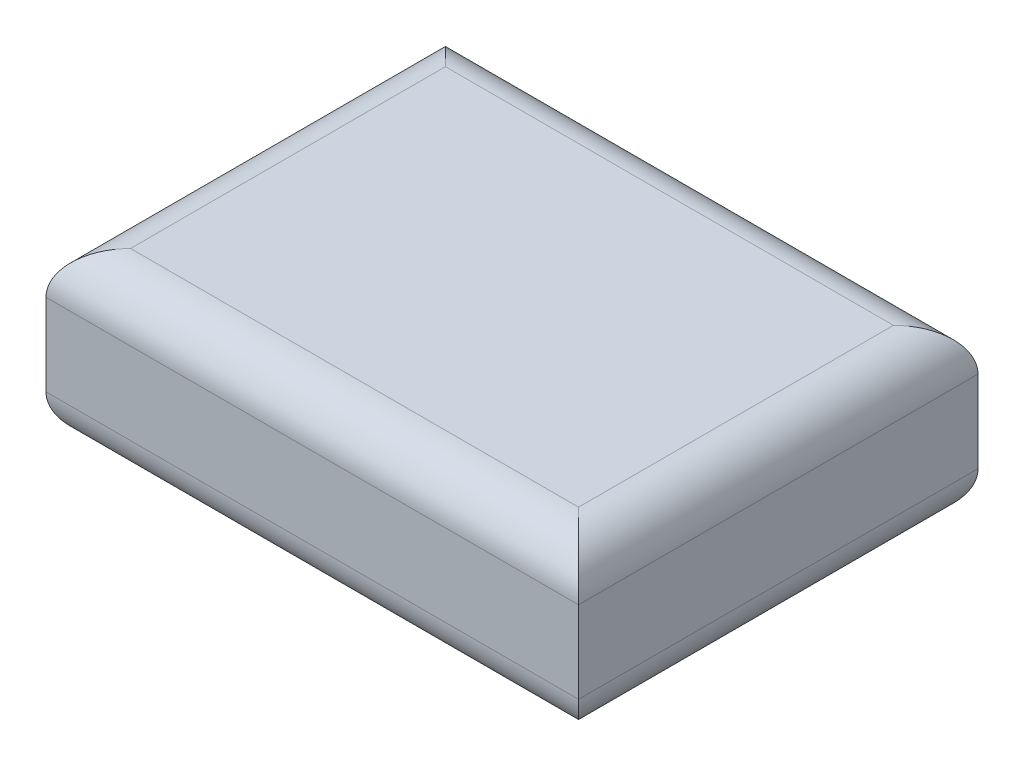
ISO-10303-21;
HEADER;
FILE_DESCRIPTION(('STEP AP214'),'2;1');
FILE_NAME('part.step','',(''),(''),'','','');
FILE_SCHEMA(('AUTOMOTIVE_DESIGN { 1 0 10303 214 1 1 1 1 }'));
ENDSEC;
DATA;
#1=APPLICATION_CONTEXT('core data for automotive mechanical design processes');
#2=APPLICATION_PROTOCOL_DEFINITION('international standard','automotive_design',2000,#1);
#3=PRODUCT_CONTEXT('',#1,'mechanical');
#4=PRODUCT('Part','Part','',(#3));
#5=PRODUCT_RELATED_PRODUCT_CATEGORY('part','',(#4));
#6=PRODUCT_DEFINITION_FORMATION('','',#4);
#7=PRODUCT_DEFINITION_CONTEXT('part definition',#1,'design');
#8=PRODUCT_DEFINITION('design','',#6,#7);
#9=PRODUCT_DEFINITION_SHAPE('','',#8);
#10=(LENGTH_UNIT() NAMED_UNIT(*) SI_UNIT(.MILLI.,.METRE.));
#11=(NAMED_UNIT(*) PLANE_ANGLE_UNIT() SI_UNIT($,.RADIAN.));
#12=(NAMED_UNIT(*) SI_UNIT($,.STERADIAN.) SOLID_ANGLE_UNIT());
#13=UNCERTAINTY_MEASURE_WITH_UNIT(LENGTH_MEASURE(1.E-05),#10,'distance_accuracy_value','');
#14=(GEOMETRIC_REPRESENTATION_CONTEXT(3) GLOBAL_UNCERTAINTY_ASSIGNED_CONTEXT((#13)) GLOBAL_UNIT_ASSIGNED_CONTEXT((#10,
#11,#12)) REPRESENTATION_CONTEXT('',''));
#15=CARTESIAN_POINT('',(0.,0.,0.));
#16=DIRECTION('',(0.,0.,1.));
#17=DIRECTION('',(1.,0.,0.));
#18=AXIS2_PLACEMENT_3D('',#15,#16,#17);
#19=CARTESIAN_POINT('',(0.,0.,12.));
#20=DIRECTION('',(1.,0.,0.));
#21=DIRECTION('',(0.,0.,-1.));
#22=AXIS2_PLACEMENT_3D('',#19,#20,#21);
#23=PLANE('',#22);
#24=DIRECTION('',(0.,-1.,0.));
#25=VECTOR('',#24,1.);
#26=CARTESIAN_POINT('',(0.,0.,0.));
#27=LINE('',#26,#25);
#28=CARTESIAN_POINT('',(0.,3.73,0.));
#29=VERTEX_POINT('',#28);
#30=CARTESIAN_POINT('',(0.,1.27,0.));
#31=VERTEX_POINT('',#30);
#32=EDGE_CURVE('E129',#29,#31,#27,.T.);
#33=ORIENTED_EDGE('',*,*,#32,.T.);
#34=DIRECTION('',(0.,0.,-1.));
#35=VECTOR('',#34,1.);
#36=CARTESIAN_POINT('',(0.,1.27,12.));
#37=LINE('',#36,#35);
#38=CARTESIAN_POINT('',(0.,1.27,12.));
#39=VERTEX_POINT('',#38);
#40=EDGE_CURVE('E52',#31,#39,#37,.F.);
#41=ORIENTED_EDGE('',*,*,#40,.T.);
#42=DIRECTION('',(0.,-1.,0.));
#43=VECTOR('',#42,1.);
#44=CARTESIAN_POINT('',(0.,0.,12.));
#45=LINE('',#44,#43);
#46=CARTESIAN_POINT('',(0.,3.73,12.));
#47=VERTEX_POINT('',#46);
#48=EDGE_CURVE('E178',#47,#39,#45,.T.);
#49=ORIENTED_EDGE('',*,*,#48,.F.);
#50=DIRECTION('',(0.,0.,-1.));
#51=VECTOR('',#50,1.);
#52=CARTESIAN_POINT('',(0.,3.73,12.));
#53=LINE('',#52,#51);
#54=EDGE_CURVE('E153',#47,#29,#53,.T.);
#55=ORIENTED_EDGE('',*,*,#54,.T.);
#56=EDGE_LOOP('',(#33,#41,#49,#55));
#57=FACE_BOUND('',#56,.T.);
#58=ADVANCED_FACE('F35',(#57),#23,.F.);
#59=CARTESIAN_POINT('',(0.,0.,12.));
#60=DIRECTION('',(0.,1.,0.));
#61=DIRECTION('',(0.,0.,1.));
#62=AXIS2_PLACEMENT_3D('',#59,#60,#61);
#63=PLANE('',#62);
#64=DIRECTION('',(0.,0.,-1.));
#65=VECTOR('',#64,1.);
#66=CARTESIAN_POINT('',(1.27,0.,12.));
#67=LINE('',#66,#65);
#68=CARTESIAN_POINT('',(1.27,0.,10.73));
#69=VERTEX_POINT('',#68);
#70=CARTESIAN_POINT('',(1.27,0.,1.27));
#71=VERTEX_POINT('',#70);
#72=EDGE_CURVE('E162',#69,#71,#67,.T.);
#73=ORIENTED_EDGE('',*,*,#72,.T.);
#74=DIRECTION('',(1.,0.,0.));
#75=VECTOR('',#74,1.);
#76=CARTESIAN_POINT('',(16.,0.,1.27));
#77=LINE('',#76,#75);
#78=CARTESIAN_POINT('',(14.73,0.,1.27));
#79=VERTEX_POINT('',#78);
#80=EDGE_CURVE('E159',#71,#79,#77,.T.);
#81=ORIENTED_EDGE('',*,*,#80,.T.);
#82=DIRECTION('',(0.,0.,-1.));
#83=VECTOR('',#82,1.);
#84=CARTESIAN_POINT('',(14.73,0.,12.));
#85=LINE('',#84,#83);
#86=CARTESIAN_POINT('',(14.73,0.,10.73));
#87=VERTEX_POINT('',#86);
#88=EDGE_CURVE('E166',#79,#87,#85,.F.);
#89=ORIENTED_EDGE('',*,*,#88,.T.);
#90=DIRECTION('',(1.,0.,0.));
#91=VECTOR('',#90,1.);
#92=CARTESIAN_POINT('',(0.,0.,10.73));
#93=LINE('',#92,#91);
#94=EDGE_CURVE('E164',#87,#69,#93,.F.);
#95=ORIENTED_EDGE('',*,*,#94,.T.);
#96=EDGE_LOOP('',(#73,#81,#89,#95));
#97=FACE_BOUND('',#96,.T.);
#98=ADVANCED_FACE('F208',(#97),#63,.F.);
#99=CARTESIAN_POINT('',(16.,0.,12.));
#100=DIRECTION('',(-1.,0.,0.));
#101=DIRECTION('',(0.,0.,1.));
#102=AXIS2_PLACEMENT_3D('',#99,#100,#101);
#103=PLANE('',#102);
#104=DIRECTION('',(0.,1.,0.));
#105=VECTOR('',#104,1.);
#106=CARTESIAN_POINT('',(16.,0.,0.));
#107=LINE('',#106,#105);
#108=CARTESIAN_POINT('',(16.,1.27,0.));
#109=VERTEX_POINT('',#108);
#110=CARTESIAN_POINT('',(16.,3.73,0.));
#111=VERTEX_POINT('',#110);
#112=EDGE_CURVE('E175',#109,#111,#107,.T.);
#113=ORIENTED_EDGE('',*,*,#112,.T.);
#114=DIRECTION('',(0.,0.,-1.));
#115=VECTOR('',#114,1.);
#116=CARTESIAN_POINT('',(16.,3.73,12.));
#117=LINE('',#116,#115);
#118=CARTESIAN_POINT('',(16.,3.73,12.));
#119=VERTEX_POINT('',#118);
#120=EDGE_CURVE('E168',#111,#119,#117,.F.);
#121=ORIENTED_EDGE('',*,*,#120,.T.);
#122=DIRECTION('',(0.,1.,0.));
#123=VECTOR('',#122,1.);
#124=CARTESIAN_POINT('',(16.,0.,12.));
#125=LINE('',#124,#123);
#126=CARTESIAN_POINT('',(16.,1.27,12.));
#127=VERTEX_POINT('',#126);
#128=EDGE_CURVE('E123',#127,#119,#125,.T.);
#129=ORIENTED_EDGE('',*,*,#128,.F.);
#130=DIRECTION('',(0.,0.,-1.));
#131=VECTOR('',#130,1.);
#132=CARTESIAN_POINT('',(16.,1.27,12.));
#133=LINE('',#132,#131);
#134=EDGE_CURVE('E171',#127,#109,#133,.T.);
#135=ORIENTED_EDGE('',*,*,#134,.T.);
#136=EDGE_LOOP('',(#113,#121,#129,#135));
#137=FACE_BOUND('',#136,.T.);
#138=ADVANCED_FACE('F190',(#137),#103,.F.);
#139=CARTESIAN_POINT('',(0.,5.,12.));
#140=DIRECTION('',(0.,-1.,0.));
#141=DIRECTION('',(0.,0.,-1.));
#142=AXIS2_PLACEMENT_3D('',#139,#140,#141);
#143=PLANE('',#142);
#144=DIRECTION('',(-1.,0.,0.));
#145=VECTOR('',#144,1.);
#146=CARTESIAN_POINT('',(0.,5.,10.73));
#147=LINE('',#146,#145);
#148=CARTESIAN_POINT('',(1.27,5.,10.73));
#149=VERTEX_POINT('',#148);
#150=CARTESIAN_POINT('',(14.73,5.,10.73));
#151=VERTEX_POINT('',#150);
#152=EDGE_CURVE('E112',#149,#151,#147,.F.);
#153=ORIENTED_EDGE('',*,*,#152,.T.);
#154=DIRECTION('',(0.,0.,-1.));
#155=VECTOR('',#154,1.);
#156=CARTESIAN_POINT('',(14.73,5.,12.));
#157=LINE('',#156,#155);
#158=CARTESIAN_POINT('',(14.73,5.,1.27));
#159=VERTEX_POINT('',#158);
#160=EDGE_CURVE('E108',#151,#159,#157,.T.);
#161=ORIENTED_EDGE('',*,*,#160,.T.);
#162=DIRECTION('',(-1.,0.,0.));
#163=VECTOR('',#162,1.);
#164=CARTESIAN_POINT('',(0.,5.,1.27));
#165=LINE('',#164,#163);
#166=CARTESIAN_POINT('',(1.27,5.,1.27));
#167=VERTEX_POINT('',#166);
#168=EDGE_CURVE('E102',#159,#167,#165,.T.);
#169=ORIENTED_EDGE('',*,*,#168,.T.);
#170=DIRECTION('',(0.,0.,-1.));
#171=VECTOR('',#170,1.);
#172=CARTESIAN_POINT('',(1.27,5.,12.));
#173=LINE('',#172,#171);
#174=EDGE_CURVE('E105',#167,#149,#173,.F.);
#175=ORIENTED_EDGE('',*,*,#174,.T.);
#176=EDGE_LOOP('',(#153,#161,#169,#175));
#177=FACE_BOUND('',#176,.T.);
#178=ADVANCED_FACE('F104',(#177),#143,.F.);
#179=CARTESIAN_POINT('',(0.,0.,12.));
#180=DIRECTION('',(0.,0.,-1.));
#181=DIRECTION('',(-1.,0.,0.));
#182=AXIS2_PLACEMENT_3D('',#179,#180,#181);
#183=PLANE('',#182);
#184=ORIENTED_EDGE('',*,*,#48,.T.);
#185=DIRECTION('',(1.,0.,0.));
#186=VECTOR('',#185,1.);
#187=CARTESIAN_POINT('',(0.,1.27,12.));
#188=LINE('',#187,#186);
#189=EDGE_CURVE('E11',#39,#127,#188,.T.);
#190=ORIENTED_EDGE('',*,*,#189,.T.);
#191=ORIENTED_EDGE('',*,*,#128,.T.);
#192=DIRECTION('',(-1.,0.,0.));
#193=VECTOR('',#192,1.);
#194=CARTESIAN_POINT('',(0.,3.73,12.));
#195=LINE('',#194,#193);
#196=EDGE_CURVE('E44',#119,#47,#195,.T.);
#197=ORIENTED_EDGE('',*,*,#196,.T.);
#198=EDGE_LOOP('',(#184,#190,#191,#197));
#199=FACE_BOUND('',#198,.T.);
#200=ADVANCED_FACE('F182',(#199),#183,.F.);
#201=CARTESIAN_POINT('',(0.,0.,0.));
#202=DIRECTION('',(0.,0.,-1.));
#203=DIRECTION('',(-1.,0.,0.));
#204=AXIS2_PLACEMENT_3D('',#201,#202,#203);
#205=PLANE('',#204);
#206=ORIENTED_EDGE('',*,*,#112,.F.);
#207=DIRECTION('',(1.,0.,0.));
#208=VECTOR('',#207,1.);
#209=CARTESIAN_POINT('',(0.,1.27,0.));
#210=LINE('',#209,#208);
#211=EDGE_CURVE('E155',#109,#31,#210,.F.);
#212=ORIENTED_EDGE('',*,*,#211,.T.);
#213=ORIENTED_EDGE('',*,*,#32,.F.);
#214=DIRECTION('',(-1.,0.,0.));
#215=VECTOR('',#214,1.);
#216=CARTESIAN_POINT('',(16.,3.73,0.));
#217=LINE('',#216,#215);
#218=EDGE_CURVE('E126',#29,#111,#217,.F.);
#219=ORIENTED_EDGE('',*,*,#218,.T.);
#220=EDGE_LOOP('',(#206,#212,#213,#219));
#221=FACE_BOUND('',#220,.T.);
#222=ADVANCED_FACE('F193',(#221),#205,.T.);
#223=CARTESIAN_POINT('',(1.27,3.73,12.));
#224=DIRECTION('',(0.,0.,-1.));
#225=DIRECTION('',(-1.,0.,0.));
#226=AXIS2_PLACEMENT_3D('',#223,#224,#225);
#227=CYLINDRICAL_SURFACE('',#226,1.27);
#228=CARTESIAN_POINT('',(1.27,3.73,1.27));
#229=DIRECTION('',(0.707106781186547,0.,-0.707106781186547));
#230=DIRECTION('',(-0.707106781186547,0.,-0.707106781186547));
#231=AXIS2_PLACEMENT_3D('',#228,#229,#230);
#232=ELLIPSE('',#231,1.79605122421383,1.27);
#233=EDGE_CURVE('E118',#29,#167,#232,.T.);
#234=ORIENTED_EDGE('',*,*,#233,.F.);
#235=ORIENTED_EDGE('',*,*,#54,.F.);
#236=CARTESIAN_POINT('',(1.27,3.73,10.73));
#237=DIRECTION('',(-0.707106781186547,0.,-0.707106781186547));
#238=DIRECTION('',(0.707106781186547,0.,-0.707106781186547));
#239=AXIS2_PLACEMENT_3D('',#236,#237,#238);
#240=ELLIPSE('',#239,1.79605122421383,1.27);
#241=EDGE_CURVE('E121',#149,#47,#240,.F.);
#242=ORIENTED_EDGE('',*,*,#241,.F.);
#243=ORIENTED_EDGE('',*,*,#174,.F.);
#244=EDGE_LOOP('',(#234,#235,#242,#243));
#245=FACE_BOUND('',#244,.T.);
#246=ADVANCED_FACE('F116',(#245),#227,.T.);
#247=CARTESIAN_POINT('',(0.,3.73,10.73));
#248=DIRECTION('',(-1.,0.,0.));
#249=DIRECTION('',(0.,0.,1.));
#250=AXIS2_PLACEMENT_3D('',#247,#248,#249);
#251=CYLINDRICAL_SURFACE('',#250,1.27);
#252=ORIENTED_EDGE('',*,*,#241,.T.);
#253=ORIENTED_EDGE('',*,*,#196,.F.);
#254=CARTESIAN_POINT('',(14.73,3.73,10.73));
#255=DIRECTION('',(-0.707106781186547,0.,0.707106781186547));
#256=DIRECTION('',(-0.707106781186547,0.,-0.707106781186547));
#257=AXIS2_PLACEMENT_3D('',#254,#255,#256);
#258=ELLIPSE('',#257,1.79605122421383,1.27);
#259=EDGE_CURVE('E127',#151,#119,#258,.F.);
#260=ORIENTED_EDGE('',*,*,#259,.F.);
#261=ORIENTED_EDGE('',*,*,#152,.F.);
#262=EDGE_LOOP('',(#252,#253,#260,#261));
#263=FACE_BOUND('',#262,.T.);
#264=ADVANCED_FACE('F221',(#263),#251,.T.);
#265=CARTESIAN_POINT('',(0.,3.73,1.27));
#266=DIRECTION('',(1.,0.,0.));
#267=DIRECTION('',(0.,0.,-1.));
#268=AXIS2_PLACEMENT_3D('',#265,#266,#267);
#269=CYLINDRICAL_SURFACE('',#268,1.27);
#270=ORIENTED_EDGE('',*,*,#233,.T.);
#271=ORIENTED_EDGE('',*,*,#168,.F.);
#272=CARTESIAN_POINT('',(14.73,3.73,1.27));
#273=DIRECTION('',(0.707106781186547,0.,0.707106781186547));
#274=DIRECTION('',(0.707106781186547,0.,-0.707106781186547));
#275=AXIS2_PLACEMENT_3D('',#272,#273,#274);
#276=ELLIPSE('',#275,1.79605122421383,1.27);
#277=EDGE_CURVE('E131',#111,#159,#276,.T.);
#278=ORIENTED_EDGE('',*,*,#277,.F.);
#279=ORIENTED_EDGE('',*,*,#218,.F.);
#280=EDGE_LOOP('',(#270,#271,#278,#279));
#281=FACE_BOUND('',#280,.T.);
#282=ADVANCED_FACE('F125',(#281),#269,.T.);
#283=CARTESIAN_POINT('',(14.73,3.73,12.));
#284=DIRECTION('',(0.,0.,-1.));
#285=DIRECTION('',(-1.,0.,0.));
#286=AXIS2_PLACEMENT_3D('',#283,#284,#285);
#287=CYLINDRICAL_SURFACE('',#286,1.27);
#288=ORIENTED_EDGE('',*,*,#259,.T.);
#289=ORIENTED_EDGE('',*,*,#120,.F.);
#290=ORIENTED_EDGE('',*,*,#277,.T.);
#291=ORIENTED_EDGE('',*,*,#160,.F.);
#292=EDGE_LOOP('',(#288,#289,#290,#291));
#293=FACE_BOUND('',#292,.T.);
#294=ADVANCED_FACE('F206',(#293),#287,.T.);
#295=CARTESIAN_POINT('',(0.,1.27,10.73));
#296=DIRECTION('',(1.,0.,0.));
#297=DIRECTION('',(0.,0.,-1.));
#298=AXIS2_PLACEMENT_3D('',#295,#296,#297);
#299=CYLINDRICAL_SURFACE('',#298,1.27);
#300=CARTESIAN_POINT('',(14.73,1.27,10.73));
#301=DIRECTION('',(0.707106781186547,0.,-0.707106781186547));
#302=DIRECTION('',(-0.707106781186547,0.,-0.707106781186547));
#303=AXIS2_PLACEMENT_3D('',#300,#301,#302);
#304=ELLIPSE('',#303,1.79605122421383,1.27);
#305=EDGE_CURVE('E138',#127,#87,#304,.T.);
#306=ORIENTED_EDGE('',*,*,#305,.F.);
#307=ORIENTED_EDGE('',*,*,#189,.F.);
#308=CARTESIAN_POINT('',(1.27,1.27,10.73));
#309=DIRECTION('',(0.707106781186547,0.,0.707106781186547));
#310=DIRECTION('',(0.707106781186547,0.,-0.707106781186547));
#311=AXIS2_PLACEMENT_3D('',#308,#309,#310);
#312=ELLIPSE('',#311,1.79605122421383,1.27);
#313=EDGE_CURVE('E39',#69,#39,#312,.F.);
#314=ORIENTED_EDGE('',*,*,#313,.F.);
#315=ORIENTED_EDGE('',*,*,#94,.F.);
#316=EDGE_LOOP('',(#306,#307,#314,#315));
#317=FACE_BOUND('',#316,.T.);
#318=ADVANCED_FACE('F37',(#317),#299,.T.);
#319=CARTESIAN_POINT('',(1.27,1.27,12.));
#320=DIRECTION('',(0.,0.,-1.));
#321=DIRECTION('',(-1.,0.,0.));
#322=AXIS2_PLACEMENT_3D('',#319,#320,#321);
#323=CYLINDRICAL_SURFACE('',#322,1.27);
#324=ORIENTED_EDGE('',*,*,#313,.T.);
#325=ORIENTED_EDGE('',*,*,#40,.F.);
#326=CARTESIAN_POINT('',(1.27,1.27,1.27));
#327=DIRECTION('',(0.707106781186547,0.,-0.707106781186547));
#328=DIRECTION('',(-0.707106781186547,0.,-0.707106781186547));
#329=AXIS2_PLACEMENT_3D('',#326,#327,#328);
#330=ELLIPSE('',#329,1.79605122421383,1.27);
#331=EDGE_CURVE('E137',#71,#31,#330,.T.);
#332=ORIENTED_EDGE('',*,*,#331,.F.);
#333=ORIENTED_EDGE('',*,*,#72,.F.);
#334=EDGE_LOOP('',(#324,#325,#332,#333));
#335=FACE_BOUND('',#334,.T.);
#336=ADVANCED_FACE('F199',(#335),#323,.T.);
#337=CARTESIAN_POINT('',(14.73,1.27,12.));
#338=DIRECTION('',(0.,0.,-1.));
#339=DIRECTION('',(-1.,0.,0.));
#340=AXIS2_PLACEMENT_3D('',#337,#338,#339);
#341=CYLINDRICAL_SURFACE('',#340,1.27);
#342=ORIENTED_EDGE('',*,*,#305,.T.);
#343=ORIENTED_EDGE('',*,*,#88,.F.);
#344=CARTESIAN_POINT('',(14.73,1.27,1.27));
#345=DIRECTION('',(-0.707106781186547,0.,-0.707106781186547));
#346=DIRECTION('',(0.707106781186547,0.,-0.707106781186547));
#347=AXIS2_PLACEMENT_3D('',#344,#345,#346);
#348=ELLIPSE('',#347,1.79605122421383,1.27);
#349=EDGE_CURVE('E135',#109,#79,#348,.T.);
#350=ORIENTED_EDGE('',*,*,#349,.F.);
#351=ORIENTED_EDGE('',*,*,#134,.F.);
#352=EDGE_LOOP('',(#342,#343,#350,#351));
#353=FACE_BOUND('',#352,.T.);
#354=ADVANCED_FACE('F187',(#353),#341,.T.);
#355=CARTESIAN_POINT('',(0.,1.27,1.27));
#356=DIRECTION('',(-1.,0.,0.));
#357=DIRECTION('',(0.,0.,1.));
#358=AXIS2_PLACEMENT_3D('',#355,#356,#357);
#359=CYLINDRICAL_SURFACE('',#358,1.27);
#360=ORIENTED_EDGE('',*,*,#331,.T.);
#361=ORIENTED_EDGE('',*,*,#211,.F.);
#362=ORIENTED_EDGE('',*,*,#349,.T.);
#363=ORIENTED_EDGE('',*,*,#80,.F.);
#364=EDGE_LOOP('',(#360,#361,#362,#363));
#365=FACE_BOUND('',#364,.T.);
#366=ADVANCED_FACE('F196',(#365),#359,.T.);
#367=CLOSED_SHELL('',(#58,#98,#138,#178,#200,#222,#246,#264,#282,#294,#318,#336,#354,#366));
#368=MANIFOLD_SOLID_BREP('B2',#367);
#369=ADVANCED_BREP_SHAPE_REPRESENTATION('',(#18,#368),#14);
#370=SHAPE_DEFINITION_REPRESENTATION(#9,#369);
ENDSEC;
END-ISO-10303-21;
